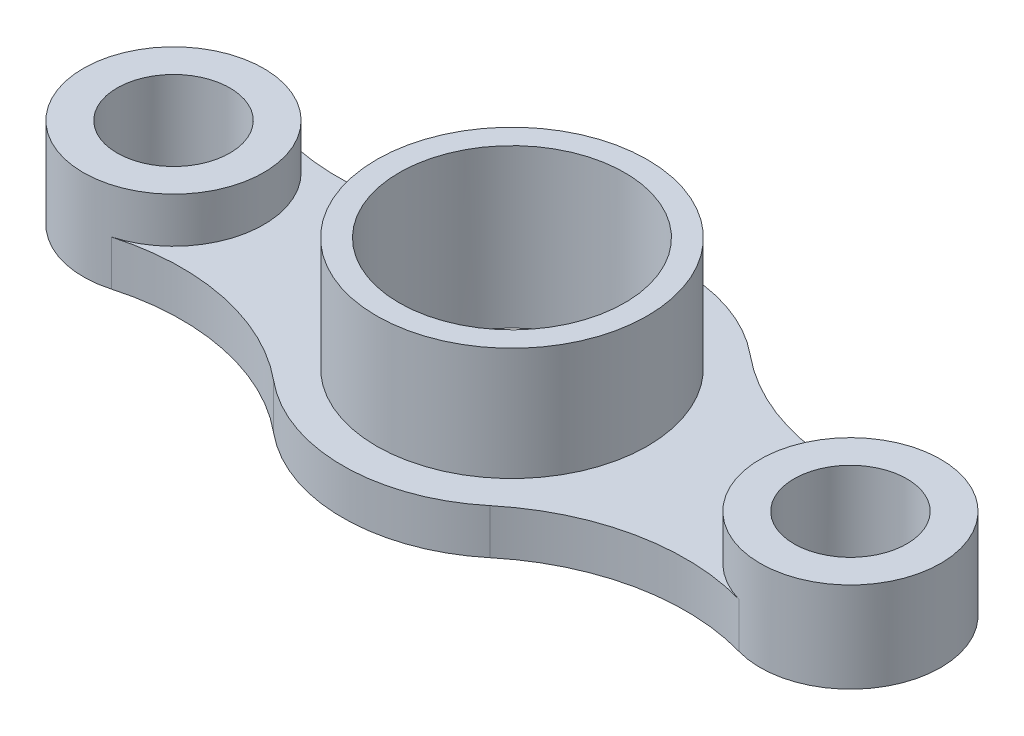
ISO-10303-21;
HEADER;
FILE_DESCRIPTION(('STEP AP214'),'2;1');
FILE_NAME('part.step','',(''),(''),'','','');
FILE_SCHEMA(('AUTOMOTIVE_DESIGN { 1 0 10303 214 1 1 1 1 }'));
ENDSEC;
DATA;
#1=APPLICATION_CONTEXT('core data for automotive mechanical design processes');
#2=APPLICATION_PROTOCOL_DEFINITION('international standard','automotive_design',2000,#1);
#3=PRODUCT_CONTEXT('',#1,'mechanical');
#4=PRODUCT('Part','Part','',(#3));
#5=PRODUCT_RELATED_PRODUCT_CATEGORY('part','',(#4));
#6=PRODUCT_DEFINITION_FORMATION('','',#4);
#7=PRODUCT_DEFINITION_CONTEXT('part definition',#1,'design');
#8=PRODUCT_DEFINITION('design','',#6,#7);
#9=PRODUCT_DEFINITION_SHAPE('','',#8);
#10=(LENGTH_UNIT() NAMED_UNIT(*) SI_UNIT(.MILLI.,.METRE.));
#11=(NAMED_UNIT(*) PLANE_ANGLE_UNIT() SI_UNIT($,.RADIAN.));
#12=(NAMED_UNIT(*) SI_UNIT($,.STERADIAN.) SOLID_ANGLE_UNIT());
#13=UNCERTAINTY_MEASURE_WITH_UNIT(LENGTH_MEASURE(1.E-05),#10,'distance_accuracy_value','');
#14=(GEOMETRIC_REPRESENTATION_CONTEXT(3) GLOBAL_UNCERTAINTY_ASSIGNED_CONTEXT((#13)) GLOBAL_UNIT_ASSIGNED_CONTEXT((#10,
#11,#12)) REPRESENTATION_CONTEXT('',''));
#15=CARTESIAN_POINT('',(0.,0.,0.));
#16=DIRECTION('',(0.,0.,1.));
#17=DIRECTION('',(1.,0.,0.));
#18=AXIS2_PLACEMENT_3D('',#15,#16,#17);
#19=CARTESIAN_POINT('',(-55.875,20.,67.3367238214037));
#20=DIRECTION('',(0.,-1.,0.));
#21=DIRECTION('',(0.,0.,-1.));
#22=AXIS2_PLACEMENT_3D('',#19,#20,#21);
#23=PLANE('',#22);
#24=CARTESIAN_POINT('',(0.,20.,0.));
#25=DIRECTION('',(0.,-1.,0.));
#26=DIRECTION('',(0.,0.,-1.));
#27=AXIS2_PLACEMENT_3D('',#24,#25,#26);
#28=CIRCLE('',#27,60.);
#29=CARTESIAN_POINT('',(0.,20.,-60.));
#30=VERTEX_POINT('',#29);
#31=EDGE_CURVE('E11',#30,#30,#28,.F.);
#32=ORIENTED_EDGE('',*,*,#31,.F.);
#33=EDGE_LOOP('',(#32));
#34=FACE_BOUND('',#33,.T.);
#35=CARTESIAN_POINT('',(150.,20.,0.));
#36=DIRECTION('',(0.,1.,0.));
#37=DIRECTION('',(0.,0.,1.));
#38=AXIS2_PLACEMENT_3D('',#35,#36,#37);
#39=CIRCLE('',#38,40.);
#40=CARTESIAN_POINT('',(139.071428571429,20.,-38.478127897945));
#41=VERTEX_POINT('',#40);
#42=CARTESIAN_POINT('',(139.071428571429,20.,38.478127897945));
#43=VERTEX_POINT('',#42);
#44=EDGE_CURVE('E122',#41,#43,#39,.T.);
#45=ORIENTED_EDGE('',*,*,#44,.F.);
#46=CARTESIAN_POINT('',(111.75,20.,-134.673447642807));
#47=DIRECTION('',(0.,-1.,0.));
#48=DIRECTION('',(0.,0.,-1.));
#49=AXIS2_PLACEMENT_3D('',#46,#47,#48);
#50=CIRCLE('',#49,100.);
#51=CARTESIAN_POINT('',(47.8928571428571,20.,-57.7171918469175));
#52=VERTEX_POINT('',#51);
#53=EDGE_CURVE('E115',#41,#52,#50,.T.);
#54=ORIENTED_EDGE('',*,*,#53,.T.);
#55=CARTESIAN_POINT('',(0.,20.,0.));
#56=DIRECTION('',(0.,1.,0.));
#57=DIRECTION('',(0.,0.,1.));
#58=AXIS2_PLACEMENT_3D('',#55,#56,#57);
#59=CIRCLE('',#58,75.);
#60=CARTESIAN_POINT('',(-47.8928571428571,20.,-57.7171918469175));
#61=VERTEX_POINT('',#60);
#62=EDGE_CURVE('E118',#52,#61,#59,.T.);
#63=ORIENTED_EDGE('',*,*,#62,.T.);
#64=CARTESIAN_POINT('',(-111.75,20.,-134.673447642807));
#65=DIRECTION('',(0.,-1.,0.));
#66=DIRECTION('',(0.,0.,1.));
#67=AXIS2_PLACEMENT_3D('',#64,#65,#66);
#68=CIRCLE('',#67,100.);
#69=CARTESIAN_POINT('',(-139.071428571429,20.,-38.478127897945));
#70=VERTEX_POINT('',#69);
#71=EDGE_CURVE('E59',#61,#70,#68,.T.);
#72=ORIENTED_EDGE('',*,*,#71,.T.);
#73=CARTESIAN_POINT('',(-150.,20.,0.));
#74=DIRECTION('',(0.,1.,0.));
#75=DIRECTION('',(0.,0.,1.));
#76=AXIS2_PLACEMENT_3D('',#73,#74,#75);
#77=CIRCLE('',#76,40.);
#78=CARTESIAN_POINT('',(-139.071428571429,20.,38.478127897945));
#79=VERTEX_POINT('',#78);
#80=EDGE_CURVE('E214',#79,#70,#77,.T.);
#81=ORIENTED_EDGE('',*,*,#80,.F.);
#82=CARTESIAN_POINT('',(-111.75,20.,134.673447642807));
#83=DIRECTION('',(0.,-1.,0.));
#84=DIRECTION('',(0.,0.,-1.));
#85=AXIS2_PLACEMENT_3D('',#82,#83,#84);
#86=CIRCLE('',#85,100.);
#87=CARTESIAN_POINT('',(-47.8928571428571,20.,57.7171918469175));
#88=VERTEX_POINT('',#87);
#89=EDGE_CURVE('E171',#79,#88,#86,.T.);
#90=ORIENTED_EDGE('',*,*,#89,.T.);
#91=CARTESIAN_POINT('',(0.,20.,0.));
#92=DIRECTION('',(0.,1.,0.));
#93=DIRECTION('',(0.,0.,1.));
#94=AXIS2_PLACEMENT_3D('',#91,#92,#93);
#95=CIRCLE('',#94,75.);
#96=CARTESIAN_POINT('',(47.8928571428571,20.,57.7171918469175));
#97=VERTEX_POINT('',#96);
#98=EDGE_CURVE('E104',#88,#97,#95,.T.);
#99=ORIENTED_EDGE('',*,*,#98,.T.);
#100=CARTESIAN_POINT('',(111.75,20.,134.673447642807));
#101=DIRECTION('',(0.,-1.,0.));
#102=DIRECTION('',(0.,0.,1.));
#103=AXIS2_PLACEMENT_3D('',#100,#101,#102);
#104=CIRCLE('',#103,100.);
#105=EDGE_CURVE('E127',#97,#43,#104,.T.);
#106=ORIENTED_EDGE('',*,*,#105,.T.);
#107=EDGE_LOOP('',(#45,#54,#63,#72,#81,#90,#99,#106));
#108=FACE_BOUND('',#107,.T.);
#109=ADVANCED_FACE('F39',(#34,#108),#23,.F.);
#110=CARTESIAN_POINT('',(-111.75,20.,134.673447642807));
#111=DIRECTION('',(0.,-1.,0.));
#112=DIRECTION('',(0.,0.,-1.));
#113=AXIS2_PLACEMENT_3D('',#110,#111,#112);
#114=CYLINDRICAL_SURFACE('',#113,100.);
#115=CARTESIAN_POINT('',(-111.75,0.,134.673447642807));
#116=DIRECTION('',(0.,-1.,0.));
#117=DIRECTION('',(0.,0.,-1.));
#118=AXIS2_PLACEMENT_3D('',#115,#116,#117);
#119=CIRCLE('',#118,100.);
#120=CARTESIAN_POINT('',(-139.071428571429,0.,38.478127897945));
#121=VERTEX_POINT('',#120);
#122=CARTESIAN_POINT('',(-47.8928571428571,0.,57.7171918469175));
#123=VERTEX_POINT('',#122);
#124=EDGE_CURVE('E148',#121,#123,#119,.T.);
#125=ORIENTED_EDGE('',*,*,#124,.T.);
#126=DIRECTION('',(0.,-1.,0.));
#127=VECTOR('',#126,1.);
#128=CARTESIAN_POINT('',(-47.8928571428571,20.,57.7171918469175));
#129=LINE('',#128,#127);
#130=EDGE_CURVE('E50',#88,#123,#129,.T.);
#131=ORIENTED_EDGE('',*,*,#130,.F.);
#132=ORIENTED_EDGE('',*,*,#89,.F.);
#133=DIRECTION('',(0.,-1.,0.));
#134=VECTOR('',#133,1.);
#135=CARTESIAN_POINT('',(-139.071428571429,20.,38.478127897945));
#136=LINE('',#135,#134);
#137=EDGE_CURVE('E144',#79,#121,#136,.T.);
#138=ORIENTED_EDGE('',*,*,#137,.T.);
#139=EDGE_LOOP('',(#125,#131,#132,#138));
#140=FACE_BOUND('',#139,.T.);
#141=ADVANCED_FACE('F41',(#140),#114,.F.);
#142=CARTESIAN_POINT('',(0.,20.,0.));
#143=DIRECTION('',(0.,-1.,0.));
#144=DIRECTION('',(0.,0.,-1.));
#145=AXIS2_PLACEMENT_3D('',#142,#143,#144);
#146=CYLINDRICAL_SURFACE('',#145,75.);
#147=CARTESIAN_POINT('',(0.,0.,0.));
#148=DIRECTION('',(0.,1.,0.));
#149=DIRECTION('',(0.,0.,1.));
#150=AXIS2_PLACEMENT_3D('',#147,#148,#149);
#151=CIRCLE('',#150,75.);
#152=CARTESIAN_POINT('',(47.8928571428571,0.,57.7171918469175));
#153=VERTEX_POINT('',#152);
#154=EDGE_CURVE('E152',#123,#153,#151,.T.);
#155=ORIENTED_EDGE('',*,*,#154,.T.);
#156=DIRECTION('',(0.,-1.,0.));
#157=VECTOR('',#156,1.);
#158=CARTESIAN_POINT('',(47.8928571428571,20.,57.7171918469175));
#159=LINE('',#158,#157);
#160=EDGE_CURVE('E185',#97,#153,#159,.T.);
#161=ORIENTED_EDGE('',*,*,#160,.F.);
#162=ORIENTED_EDGE('',*,*,#98,.F.);
#163=ORIENTED_EDGE('',*,*,#130,.T.);
#164=EDGE_LOOP('',(#155,#161,#162,#163));
#165=FACE_BOUND('',#164,.T.);
#166=ADVANCED_FACE('F249',(#165),#146,.T.);
#167=CARTESIAN_POINT('',(111.75,20.,134.673447642807));
#168=DIRECTION('',(0.,-1.,0.));
#169=DIRECTION('',(0.,0.,-1.));
#170=AXIS2_PLACEMENT_3D('',#167,#168,#169);
#171=CYLINDRICAL_SURFACE('',#170,100.);
#172=CARTESIAN_POINT('',(111.75,0.,134.673447642807));
#173=DIRECTION('',(0.,-1.,0.));
#174=DIRECTION('',(0.,0.,1.));
#175=AXIS2_PLACEMENT_3D('',#172,#173,#174);
#176=CIRCLE('',#175,100.);
#177=CARTESIAN_POINT('',(139.071428571429,0.,38.478127897945));
#178=VERTEX_POINT('',#177);
#179=EDGE_CURVE('E156',#153,#178,#176,.T.);
#180=ORIENTED_EDGE('',*,*,#179,.T.);
#181=DIRECTION('',(0.,-1.,0.));
#182=VECTOR('',#181,1.);
#183=CARTESIAN_POINT('',(139.071428571429,20.,38.478127897945));
#184=LINE('',#183,#182);
#185=EDGE_CURVE('E181',#43,#178,#184,.T.);
#186=ORIENTED_EDGE('',*,*,#185,.F.);
#187=ORIENTED_EDGE('',*,*,#105,.F.);
#188=ORIENTED_EDGE('',*,*,#160,.T.);
#189=EDGE_LOOP('',(#180,#186,#187,#188));
#190=FACE_BOUND('',#189,.T.);
#191=ADVANCED_FACE('F234',(#190),#171,.F.);
#192=CARTESIAN_POINT('',(150.,20.,0.));
#193=DIRECTION('',(0.,-1.,0.));
#194=DIRECTION('',(0.,0.,-1.));
#195=AXIS2_PLACEMENT_3D('',#192,#193,#194);
#196=CYLINDRICAL_SURFACE('',#195,40.);
#197=CARTESIAN_POINT('',(150.,0.,0.));
#198=DIRECTION('',(0.,1.,0.));
#199=DIRECTION('',(0.,0.,-1.));
#200=AXIS2_PLACEMENT_3D('',#197,#198,#199);
#201=CIRCLE('',#200,40.);
#202=CARTESIAN_POINT('',(139.071428571429,0.,-38.478127897945));
#203=VERTEX_POINT('',#202);
#204=EDGE_CURVE('E159',#178,#203,#201,.T.);
#205=ORIENTED_EDGE('',*,*,#204,.T.);
#206=DIRECTION('',(0.,-1.,0.));
#207=VECTOR('',#206,1.);
#208=CARTESIAN_POINT('',(139.071428571429,20.,-38.478127897945));
#209=LINE('',#208,#207);
#210=EDGE_CURVE('E137',#41,#203,#209,.T.);
#211=ORIENTED_EDGE('',*,*,#210,.F.);
#212=ORIENTED_EDGE('',*,*,#44,.T.);
#213=ORIENTED_EDGE('',*,*,#185,.T.);
#214=EDGE_LOOP('',(#205,#211,#212,#213));
#215=FACE_BOUND('',#214,.T.);
#216=CARTESIAN_POINT('',(150.,40.,0.));
#217=DIRECTION('',(0.,1.,0.));
#218=DIRECTION('',(0.,0.,1.));
#219=AXIS2_PLACEMENT_3D('',#216,#217,#218);
#220=CIRCLE('',#219,40.);
#221=CARTESIAN_POINT('',(150.,40.,40.));
#222=VERTEX_POINT('',#221);
#223=EDGE_CURVE('E210',#222,#222,#220,.T.);
#224=ORIENTED_EDGE('',*,*,#223,.F.);
#225=EDGE_LOOP('',(#224));
#226=FACE_BOUND('',#225,.T.);
#227=ADVANCED_FACE('F238',(#215,#226),#196,.T.);
#228=CARTESIAN_POINT('',(111.75,20.,-134.673447642807));
#229=DIRECTION('',(0.,-1.,0.));
#230=DIRECTION('',(0.,0.,-1.));
#231=AXIS2_PLACEMENT_3D('',#228,#229,#230);
#232=CYLINDRICAL_SURFACE('',#231,100.);
#233=CARTESIAN_POINT('',(111.75,0.,-134.673447642807));
#234=DIRECTION('',(0.,-1.,0.));
#235=DIRECTION('',(0.,0.,-1.));
#236=AXIS2_PLACEMENT_3D('',#233,#234,#235);
#237=CIRCLE('',#236,100.);
#238=CARTESIAN_POINT('',(47.8928571428571,0.,-57.7171918469175));
#239=VERTEX_POINT('',#238);
#240=EDGE_CURVE('E133',#203,#239,#237,.T.);
#241=ORIENTED_EDGE('',*,*,#240,.T.);
#242=DIRECTION('',(0.,-1.,0.));
#243=VECTOR('',#242,1.);
#244=CARTESIAN_POINT('',(47.8928571428571,20.,-57.7171918469175));
#245=LINE('',#244,#243);
#246=EDGE_CURVE('E130',#52,#239,#245,.T.);
#247=ORIENTED_EDGE('',*,*,#246,.F.);
#248=ORIENTED_EDGE('',*,*,#53,.F.);
#249=ORIENTED_EDGE('',*,*,#210,.T.);
#250=EDGE_LOOP('',(#241,#247,#248,#249));
#251=FACE_BOUND('',#250,.T.);
#252=ADVANCED_FACE('F131',(#251),#232,.F.);
#253=CARTESIAN_POINT('',(0.,20.,0.));
#254=DIRECTION('',(0.,-1.,0.));
#255=DIRECTION('',(0.,0.,-1.));
#256=AXIS2_PLACEMENT_3D('',#253,#254,#255);
#257=CYLINDRICAL_SURFACE('',#256,75.);
#258=CARTESIAN_POINT('',(0.,0.,0.));
#259=DIRECTION('',(0.,1.,0.));
#260=DIRECTION('',(0.,0.,1.));
#261=AXIS2_PLACEMENT_3D('',#258,#259,#260);
#262=CIRCLE('',#261,75.);
#263=CARTESIAN_POINT('',(-47.8928571428571,0.,-57.7171918469175));
#264=VERTEX_POINT('',#263);
#265=EDGE_CURVE('E164',#239,#264,#262,.T.);
#266=ORIENTED_EDGE('',*,*,#265,.T.);
#267=DIRECTION('',(0.,-1.,0.));
#268=VECTOR('',#267,1.);
#269=CARTESIAN_POINT('',(-47.8928571428571,20.,-57.7171918469175));
#270=LINE('',#269,#268);
#271=EDGE_CURVE('E138',#61,#264,#270,.T.);
#272=ORIENTED_EDGE('',*,*,#271,.F.);
#273=ORIENTED_EDGE('',*,*,#62,.F.);
#274=ORIENTED_EDGE('',*,*,#246,.T.);
#275=EDGE_LOOP('',(#266,#272,#273,#274));
#276=FACE_BOUND('',#275,.T.);
#277=ADVANCED_FACE('F140',(#276),#257,.T.);
#278=CARTESIAN_POINT('',(-111.75,20.,-134.673447642807));
#279=DIRECTION('',(0.,-1.,0.));
#280=DIRECTION('',(0.,0.,-1.));
#281=AXIS2_PLACEMENT_3D('',#278,#279,#280);
#282=CYLINDRICAL_SURFACE('',#281,100.);
#283=CARTESIAN_POINT('',(-111.75,0.,-134.673447642807));
#284=DIRECTION('',(0.,-1.,0.));
#285=DIRECTION('',(0.,0.,1.));
#286=AXIS2_PLACEMENT_3D('',#283,#284,#285);
#287=CIRCLE('',#286,100.);
#288=CARTESIAN_POINT('',(-139.071428571429,0.,-38.478127897945));
#289=VERTEX_POINT('',#288);
#290=EDGE_CURVE('E88',#264,#289,#287,.T.);
#291=ORIENTED_EDGE('',*,*,#290,.T.);
#292=DIRECTION('',(0.,-1.,0.));
#293=VECTOR('',#292,1.);
#294=CARTESIAN_POINT('',(-139.071428571429,20.,-38.478127897945));
#295=LINE('',#294,#293);
#296=EDGE_CURVE('E174',#70,#289,#295,.T.);
#297=ORIENTED_EDGE('',*,*,#296,.F.);
#298=ORIENTED_EDGE('',*,*,#71,.F.);
#299=ORIENTED_EDGE('',*,*,#271,.T.);
#300=EDGE_LOOP('',(#291,#297,#298,#299));
#301=FACE_BOUND('',#300,.T.);
#302=ADVANCED_FACE('F243',(#301),#282,.F.);
#303=CARTESIAN_POINT('',(-150.,20.,0.));
#304=DIRECTION('',(0.,-1.,0.));
#305=DIRECTION('',(0.,0.,-1.));
#306=AXIS2_PLACEMENT_3D('',#303,#304,#305);
#307=CYLINDRICAL_SURFACE('',#306,40.);
#308=CARTESIAN_POINT('',(-150.,0.,0.));
#309=DIRECTION('',(0.,1.,0.));
#310=DIRECTION('',(0.,0.,1.));
#311=AXIS2_PLACEMENT_3D('',#308,#309,#310);
#312=CIRCLE('',#311,40.);
#313=EDGE_CURVE('E95',#289,#121,#312,.T.);
#314=ORIENTED_EDGE('',*,*,#313,.T.);
#315=ORIENTED_EDGE('',*,*,#137,.F.);
#316=ORIENTED_EDGE('',*,*,#80,.T.);
#317=ORIENTED_EDGE('',*,*,#296,.T.);
#318=EDGE_LOOP('',(#314,#315,#316,#317));
#319=FACE_BOUND('',#318,.T.);
#320=CARTESIAN_POINT('',(-150.,40.,0.));
#321=DIRECTION('',(0.,1.,0.));
#322=DIRECTION('',(0.,0.,1.));
#323=AXIS2_PLACEMENT_3D('',#320,#321,#322);
#324=CIRCLE('',#323,40.);
#325=CARTESIAN_POINT('',(-150.,40.,40.));
#326=VERTEX_POINT('',#325);
#327=EDGE_CURVE('E217',#326,#326,#324,.T.);
#328=ORIENTED_EDGE('',*,*,#327,.F.);
#329=EDGE_LOOP('',(#328));
#330=FACE_BOUND('',#329,.T.);
#331=ADVANCED_FACE('F244',(#319,#330),#307,.T.);
#332=CARTESIAN_POINT('',(-55.875,0.,67.3367238214037));
#333=DIRECTION('',(0.,-1.,0.));
#334=DIRECTION('',(0.,0.,-1.));
#335=AXIS2_PLACEMENT_3D('',#332,#333,#334);
#336=PLANE('',#335);
#337=CARTESIAN_POINT('',(150.,0.,0.));
#338=DIRECTION('',(0.,-1.,0.));
#339=DIRECTION('',(0.,0.,-1.));
#340=AXIS2_PLACEMENT_3D('',#337,#338,#339);
#341=CIRCLE('',#340,25.);
#342=CARTESIAN_POINT('',(150.,0.,-25.));
#343=VERTEX_POINT('',#342);
#344=EDGE_CURVE('E417',#343,#343,#341,.F.);
#345=ORIENTED_EDGE('',*,*,#344,.T.);
#346=EDGE_LOOP('',(#345));
#347=FACE_BOUND('',#346,.T.);
#348=CARTESIAN_POINT('',(-150.,0.,0.));
#349=DIRECTION('',(0.,-1.,0.));
#350=DIRECTION('',(0.,0.,-1.));
#351=AXIS2_PLACEMENT_3D('',#348,#349,#350);
#352=CIRCLE('',#351,25.);
#353=CARTESIAN_POINT('',(-150.,0.,-25.));
#354=VERTEX_POINT('',#353);
#355=EDGE_CURVE('E206',#354,#354,#352,.F.);
#356=ORIENTED_EDGE('',*,*,#355,.T.);
#357=EDGE_LOOP('',(#356));
#358=FACE_BOUND('',#357,.T.);
#359=CARTESIAN_POINT('',(0.,0.,0.));
#360=DIRECTION('',(0.,-1.,0.));
#361=DIRECTION('',(0.,0.,-1.));
#362=AXIS2_PLACEMENT_3D('',#359,#360,#361);
#363=CIRCLE('',#362,50.);
#364=CARTESIAN_POINT('',(0.,0.,-50.));
#365=VERTEX_POINT('',#364);
#366=EDGE_CURVE('E193',#365,#365,#363,.F.);
#367=ORIENTED_EDGE('',*,*,#366,.T.);
#368=EDGE_LOOP('',(#367));
#369=FACE_BOUND('',#368,.T.);
#370=ORIENTED_EDGE('',*,*,#124,.F.);
#371=ORIENTED_EDGE('',*,*,#313,.F.);
#372=ORIENTED_EDGE('',*,*,#290,.F.);
#373=ORIENTED_EDGE('',*,*,#265,.F.);
#374=ORIENTED_EDGE('',*,*,#240,.F.);
#375=ORIENTED_EDGE('',*,*,#204,.F.);
#376=ORIENTED_EDGE('',*,*,#179,.F.);
#377=ORIENTED_EDGE('',*,*,#154,.F.);
#378=EDGE_LOOP('',(#370,#371,#372,#373,#374,#375,#376,#377));
#379=FACE_BOUND('',#378,.T.);
#380=ADVANCED_FACE('F242',(#347,#358,#369,#379),#336,.T.);
#381=CARTESIAN_POINT('',(0.,70.,0.));
#382=DIRECTION('',(0.,-1.,0.));
#383=DIRECTION('',(0.,0.,-1.));
#384=AXIS2_PLACEMENT_3D('',#381,#382,#383);
#385=CYLINDRICAL_SURFACE('',#384,60.);
#386=CARTESIAN_POINT('',(0.,70.,0.));
#387=DIRECTION('',(0.,1.,0.));
#388=DIRECTION('',(0.,0.,1.));
#389=AXIS2_PLACEMENT_3D('',#386,#387,#388);
#390=CIRCLE('',#389,60.);
#391=CARTESIAN_POINT('',(0.,70.,60.));
#392=VERTEX_POINT('',#391);
#393=EDGE_CURVE('E153',#392,#392,#390,.T.);
#394=ORIENTED_EDGE('',*,*,#393,.F.);
#395=EDGE_LOOP('',(#394));
#396=FACE_BOUND('',#395,.T.);
#397=ORIENTED_EDGE('',*,*,#31,.T.);
#398=EDGE_LOOP('',(#397));
#399=FACE_BOUND('',#398,.T.);
#400=ADVANCED_FACE('F264',(#396,#399),#385,.T.);
#401=CARTESIAN_POINT('',(0.,70.,0.));
#402=DIRECTION('',(0.,1.,0.));
#403=DIRECTION('',(0.,0.,1.));
#404=AXIS2_PLACEMENT_3D('',#401,#402,#403);
#405=PLANE('',#404);
#406=CARTESIAN_POINT('',(0.,70.,0.));
#407=DIRECTION('',(0.,1.,0.));
#408=DIRECTION('',(0.,0.,1.));
#409=AXIS2_PLACEMENT_3D('',#406,#407,#408);
#410=CIRCLE('',#409,50.);
#411=CARTESIAN_POINT('',(0.,70.,50.));
#412=VERTEX_POINT('',#411);
#413=EDGE_CURVE('E200',#412,#412,#410,.T.);
#414=ORIENTED_EDGE('',*,*,#413,.F.);
#415=EDGE_LOOP('',(#414));
#416=FACE_BOUND('',#415,.T.);
#417=ORIENTED_EDGE('',*,*,#393,.T.);
#418=EDGE_LOOP('',(#417));
#419=FACE_BOUND('',#418,.T.);
#420=ADVANCED_FACE('F309',(#416,#419),#405,.T.);
#421=CARTESIAN_POINT('',(-150.,40.,0.));
#422=DIRECTION('',(0.,1.,0.));
#423=DIRECTION('',(0.,0.,1.));
#424=AXIS2_PLACEMENT_3D('',#421,#422,#423);
#425=PLANE('',#424);
#426=CARTESIAN_POINT('',(-150.,40.,0.));
#427=DIRECTION('',(0.,1.,0.));
#428=DIRECTION('',(0.,0.,1.));
#429=AXIS2_PLACEMENT_3D('',#426,#427,#428);
#430=CIRCLE('',#429,25.);
#431=CARTESIAN_POINT('',(-150.,40.,25.));
#432=VERTEX_POINT('',#431);
#433=EDGE_CURVE('E43',#432,#432,#430,.T.);
#434=ORIENTED_EDGE('',*,*,#433,.F.);
#435=EDGE_LOOP('',(#434));
#436=FACE_BOUND('',#435,.T.);
#437=ORIENTED_EDGE('',*,*,#327,.T.);
#438=EDGE_LOOP('',(#437));
#439=FACE_BOUND('',#438,.T.);
#440=ADVANCED_FACE('F315',(#436,#439),#425,.T.);
#441=CARTESIAN_POINT('',(150.,40.,0.));
#442=DIRECTION('',(0.,1.,0.));
#443=DIRECTION('',(0.,0.,1.));
#444=AXIS2_PLACEMENT_3D('',#441,#442,#443);
#445=PLANE('',#444);
#446=CARTESIAN_POINT('',(150.,40.,0.));
#447=DIRECTION('',(0.,1.,0.));
#448=DIRECTION('',(0.,0.,1.));
#449=AXIS2_PLACEMENT_3D('',#446,#447,#448);
#450=CIRCLE('',#449,25.);
#451=CARTESIAN_POINT('',(150.,40.,25.));
#452=VERTEX_POINT('',#451);
#453=EDGE_CURVE('E190',#452,#452,#450,.T.);
#454=ORIENTED_EDGE('',*,*,#453,.F.);
#455=EDGE_LOOP('',(#454));
#456=FACE_BOUND('',#455,.T.);
#457=ORIENTED_EDGE('',*,*,#223,.T.);
#458=EDGE_LOOP('',(#457));
#459=FACE_BOUND('',#458,.T.);
#460=ADVANCED_FACE('F322',(#456,#459),#445,.T.);
#461=CARTESIAN_POINT('',(150.,-141.42135623731,0.));
#462=DIRECTION('',(0.,1.,0.));
#463=DIRECTION('',(0.,0.,1.));
#464=AXIS2_PLACEMENT_3D('',#461,#462,#463);
#465=CYLINDRICAL_SURFACE('',#464,25.);
#466=ORIENTED_EDGE('',*,*,#453,.T.);
#467=EDGE_LOOP('',(#466));
#468=FACE_BOUND('',#467,.T.);
#469=ORIENTED_EDGE('',*,*,#344,.F.);
#470=EDGE_LOOP('',(#469));
#471=FACE_BOUND('',#470,.T.);
#472=ADVANCED_FACE('F330',(#468,#471),#465,.F.);
#473=CARTESIAN_POINT('',(-150.,-141.42135623731,0.));
#474=DIRECTION('',(0.,1.,0.));
#475=DIRECTION('',(0.,0.,1.));
#476=AXIS2_PLACEMENT_3D('',#473,#474,#475);
#477=CYLINDRICAL_SURFACE('',#476,25.);
#478=ORIENTED_EDGE('',*,*,#433,.T.);
#479=EDGE_LOOP('',(#478));
#480=FACE_BOUND('',#479,.T.);
#481=ORIENTED_EDGE('',*,*,#355,.F.);
#482=EDGE_LOOP('',(#481));
#483=FACE_BOUND('',#482,.T.);
#484=ADVANCED_FACE('F338',(#480,#483),#477,.F.);
#485=CARTESIAN_POINT('',(0.,-141.42135623731,0.));
#486=DIRECTION('',(0.,1.,0.));
#487=DIRECTION('',(0.,0.,1.));
#488=AXIS2_PLACEMENT_3D('',#485,#486,#487);
#489=CYLINDRICAL_SURFACE('',#488,50.);
#490=ORIENTED_EDGE('',*,*,#413,.T.);
#491=EDGE_LOOP('',(#490));
#492=FACE_BOUND('',#491,.T.);
#493=ORIENTED_EDGE('',*,*,#366,.F.);
#494=EDGE_LOOP('',(#493));
#495=FACE_BOUND('',#494,.T.);
#496=ADVANCED_FACE('F345',(#492,#495),#489,.F.);
#497=CLOSED_SHELL('',(#109,#141,#166,#191,#227,#252,#277,#302,#331,#380,#400,#420,#440,#460,
#472,#484,#496));
#498=MANIFOLD_SOLID_BREP('B2',#497);
#499=ADVANCED_BREP_SHAPE_REPRESENTATION('',(#18,#498),#14);
#500=SHAPE_DEFINITION_REPRESENTATION(#9,#499);
ENDSEC;
END-ISO-10303-21;
